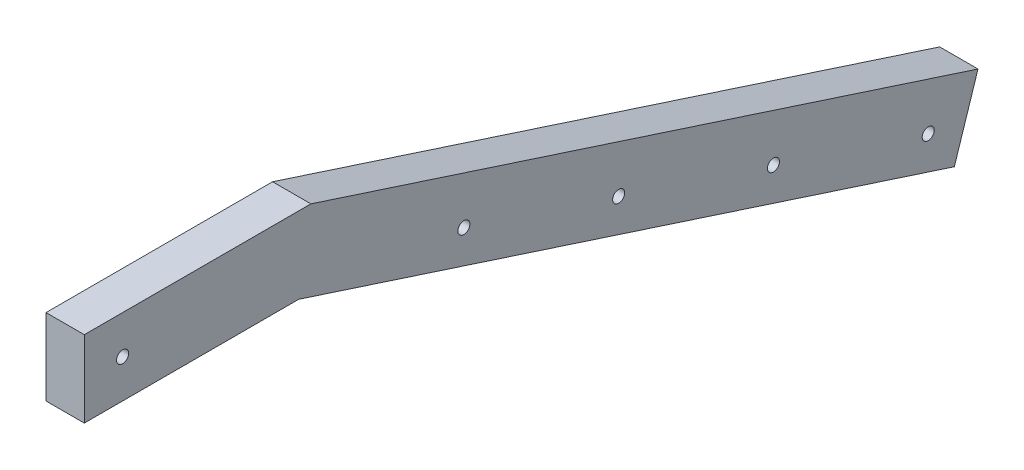
ISO-10303-21;
HEADER;
FILE_DESCRIPTION(('STEP AP214'),'2;1');
FILE_NAME('part.step','',(''),(''),'','','');
FILE_SCHEMA(('AUTOMOTIVE_DESIGN { 1 0 10303 214 1 1 1 1 }'));
ENDSEC;
DATA;
#1=APPLICATION_CONTEXT('core data for automotive mechanical design processes');
#2=APPLICATION_PROTOCOL_DEFINITION('international standard','automotive_design',2000,#1);
#3=PRODUCT_CONTEXT('',#1,'mechanical');
#4=PRODUCT('Part','Part','',(#3));
#5=PRODUCT_RELATED_PRODUCT_CATEGORY('part','',(#4));
#6=PRODUCT_DEFINITION_FORMATION('','',#4);
#7=PRODUCT_DEFINITION_CONTEXT('part definition',#1,'design');
#8=PRODUCT_DEFINITION('design','',#6,#7);
#9=PRODUCT_DEFINITION_SHAPE('','',#8);
#10=(LENGTH_UNIT() NAMED_UNIT(*) SI_UNIT(.MILLI.,.METRE.));
#11=(NAMED_UNIT(*) PLANE_ANGLE_UNIT() SI_UNIT($,.RADIAN.));
#12=(NAMED_UNIT(*) SI_UNIT($,.STERADIAN.) SOLID_ANGLE_UNIT());
#13=UNCERTAINTY_MEASURE_WITH_UNIT(LENGTH_MEASURE(1.E-05),#10,'distance_accuracy_value','');
#14=(GEOMETRIC_REPRESENTATION_CONTEXT(3) GLOBAL_UNCERTAINTY_ASSIGNED_CONTEXT((#13)) GLOBAL_UNIT_ASSIGNED_CONTEXT((#10,
#11,#12)) REPRESENTATION_CONTEXT('',''));
#15=CARTESIAN_POINT('',(0.,0.,0.));
#16=DIRECTION('',(0.,0.,1.));
#17=DIRECTION('',(1.,0.,0.));
#18=AXIS2_PLACEMENT_3D('',#15,#16,#17);
#19=CARTESIAN_POINT('',(25.4,-64.3678934919232,-101.466383411454));
#20=DIRECTION('',(-1.,0.,0.));
#21=DIRECTION('',(0.,0.,1.));
#22=AXIS2_PLACEMENT_3D('',#19,#20,#21);
#23=CYLINDRICAL_SURFACE('',#22,3.99999999999999);
#24=CARTESIAN_POINT('',(25.4,-64.3678934919232,-101.466383411454));
#25=DIRECTION('',(-1.,0.,0.));
#26=DIRECTION('',(0.,0.,1.));
#27=AXIS2_PLACEMENT_3D('',#24,#25,#26);
#28=CIRCLE('',#27,3.99999999999999);
#29=CARTESIAN_POINT('',(25.4,-64.3678934919232,-97.4663834114539));
#30=VERTEX_POINT('',#29);
#31=EDGE_CURVE('E43',#30,#30,#28,.T.);
#32=ORIENTED_EDGE('',*,*,#31,.F.);
#33=EDGE_LOOP('',(#32));
#34=FACE_BOUND('',#33,.T.);
#35=CARTESIAN_POINT('',(0.,-64.3678934919232,-101.466383411454));
#36=DIRECTION('',(-1.,0.,0.));
#37=DIRECTION('',(0.,0.,1.));
#38=AXIS2_PLACEMENT_3D('',#35,#36,#37);
#39=CIRCLE('',#38,3.99999999999999);
#40=CARTESIAN_POINT('',(0.,-64.3678934919232,-97.4663834114539));
#41=VERTEX_POINT('',#40);
#42=EDGE_CURVE('E11',#41,#41,#39,.T.);
#43=ORIENTED_EDGE('',*,*,#42,.T.);
#44=EDGE_LOOP('',(#43));
#45=FACE_BOUND('',#44,.T.);
#46=ADVANCED_FACE('F35',(#34,#45),#23,.F.);
#47=CARTESIAN_POINT('',(25.4,-97.7262780346996,-204.132934345515));
#48=DIRECTION('',(-1.,0.,0.));
#49=DIRECTION('',(0.,0.,1.));
#50=AXIS2_PLACEMENT_3D('',#47,#48,#49);
#51=CYLINDRICAL_SURFACE('',#50,3.99999999999999);
#52=CARTESIAN_POINT('',(25.4,-97.7262780346996,-204.132934345515));
#53=DIRECTION('',(-1.,0.,0.));
#54=DIRECTION('',(0.,0.,1.));
#55=AXIS2_PLACEMENT_3D('',#52,#53,#54);
#56=CIRCLE('',#55,3.99999999999999);
#57=CARTESIAN_POINT('',(25.4,-97.7262780346996,-200.132934345515));
#58=VERTEX_POINT('',#57);
#59=EDGE_CURVE('E150',#58,#58,#56,.T.);
#60=ORIENTED_EDGE('',*,*,#59,.F.);
#61=EDGE_LOOP('',(#60));
#62=FACE_BOUND('',#61,.T.);
#63=CARTESIAN_POINT('',(0.,-97.7262780346996,-204.132934345515));
#64=DIRECTION('',(-1.,0.,0.));
#65=DIRECTION('',(0.,0.,1.));
#66=AXIS2_PLACEMENT_3D('',#63,#64,#65);
#67=CIRCLE('',#66,3.99999999999999);
#68=CARTESIAN_POINT('',(0.,-97.7262780346996,-200.132934345515));
#69=VERTEX_POINT('',#68);
#70=EDGE_CURVE('E153',#69,#69,#67,.T.);
#71=ORIENTED_EDGE('',*,*,#70,.T.);
#72=EDGE_LOOP('',(#71));
#73=FACE_BOUND('',#72,.T.);
#74=ADVANCED_FACE('F162',(#62,#73),#51,.F.);
#75=CARTESIAN_POINT('',(25.4,-131.084662577476,-306.799485279577));
#76=DIRECTION('',(-1.,0.,0.));
#77=DIRECTION('',(0.,0.,1.));
#78=AXIS2_PLACEMENT_3D('',#75,#76,#77);
#79=CYLINDRICAL_SURFACE('',#78,3.99999999999999);
#80=CARTESIAN_POINT('',(25.4,-131.084662577476,-306.799485279577));
#81=DIRECTION('',(-1.,0.,0.));
#82=DIRECTION('',(0.,0.,1.));
#83=AXIS2_PLACEMENT_3D('',#80,#81,#82);
#84=CIRCLE('',#83,3.99999999999999);
#85=CARTESIAN_POINT('',(25.4,-131.084662577476,-302.799485279577));
#86=VERTEX_POINT('',#85);
#87=EDGE_CURVE('E139',#86,#86,#84,.T.);
#88=ORIENTED_EDGE('',*,*,#87,.F.);
#89=EDGE_LOOP('',(#88));
#90=FACE_BOUND('',#89,.T.);
#91=CARTESIAN_POINT('',(0.,-131.084662577476,-306.799485279577));
#92=DIRECTION('',(-1.,0.,0.));
#93=DIRECTION('',(0.,0.,1.));
#94=AXIS2_PLACEMENT_3D('',#91,#92,#93);
#95=CIRCLE('',#94,3.99999999999999);
#96=CARTESIAN_POINT('',(0.,-131.084662577476,-302.799485279577));
#97=VERTEX_POINT('',#96);
#98=EDGE_CURVE('E147',#97,#97,#95,.T.);
#99=ORIENTED_EDGE('',*,*,#98,.T.);
#100=EDGE_LOOP('',(#99));
#101=FACE_BOUND('',#100,.T.);
#102=ADVANCED_FACE('F225',(#90,#101),#79,.F.);
#103=CARTESIAN_POINT('',(25.4,0.,0.));
#104=DIRECTION('',(0.,0.951056516295151,-0.309016994374955));
#105=DIRECTION('',(0.,0.309016994374955,0.951056516295151));
#106=AXIS2_PLACEMENT_3D('',#103,#104,#105);
#107=PLANE('',#106);
#108=DIRECTION('',(0.,-0.309016994374955,-0.951056516295151));
#109=VECTOR('',#108,1.);
#110=CARTESIAN_POINT('',(0.,0.,0.));
#111=LINE('',#110,#109);
#112=CARTESIAN_POINT('',(0.,0.,0.));
#113=VERTEX_POINT('',#112);
#114=CARTESIAN_POINT('',(0.,-143.768898800436,-442.475172995904));
#115=VERTEX_POINT('',#114);
#116=EDGE_CURVE('E123',#113,#115,#111,.T.);
#117=ORIENTED_EDGE('',*,*,#116,.F.);
#118=DIRECTION('',(-1.,0.,0.));
#119=VECTOR('',#118,1.);
#120=CARTESIAN_POINT('',(25.4,0.,0.));
#121=LINE('',#120,#119);
#122=CARTESIAN_POINT('',(25.4,0.,0.));
#123=VERTEX_POINT('',#122);
#124=EDGE_CURVE('E51',#123,#113,#121,.T.);
#125=ORIENTED_EDGE('',*,*,#124,.F.);
#126=DIRECTION('',(0.,-0.309016994374955,-0.951056516295151));
#127=VECTOR('',#126,1.);
#128=CARTESIAN_POINT('',(25.4,0.,0.));
#129=LINE('',#128,#127);
#130=CARTESIAN_POINT('',(25.4,-143.768898800436,-442.475172995904));
#131=VERTEX_POINT('',#130);
#132=EDGE_CURVE('E137',#123,#131,#129,.T.);
#133=ORIENTED_EDGE('',*,*,#132,.T.);
#134=DIRECTION('',(-1.,0.,0.));
#135=VECTOR('',#134,1.);
#136=CARTESIAN_POINT('',(25.4,-143.768898800436,-442.475172995904));
#137=LINE('',#136,#135);
#138=EDGE_CURVE('E83',#131,#115,#137,.T.);
#139=ORIENTED_EDGE('',*,*,#138,.T.);
#140=EDGE_LOOP('',(#117,#125,#133,#139));
#141=FACE_BOUND('',#140,.T.);
#142=ADVANCED_FACE('F183',(#141),#107,.T.);
#143=CARTESIAN_POINT('',(25.4,0.,0.));
#144=DIRECTION('',(0.,-1.,0.));
#145=DIRECTION('',(0.,0.,-1.));
#146=AXIS2_PLACEMENT_3D('',#143,#144,#145);
#147=PLANE('',#146);
#148=DIRECTION('',(0.,0.,1.));
#149=VECTOR('',#148,1.);
#150=CARTESIAN_POINT('',(0.,0.,0.));
#151=LINE('',#150,#149);
#152=CARTESIAN_POINT('',(0.,0.,150.285929568486));
#153=VERTEX_POINT('',#152);
#154=EDGE_CURVE('E74',#113,#153,#151,.T.);
#155=ORIENTED_EDGE('',*,*,#154,.T.);
#156=DIRECTION('',(-1.,0.,0.));
#157=VECTOR('',#156,1.);
#158=CARTESIAN_POINT('',(25.4,0.,150.285929568486));
#159=LINE('',#158,#157);
#160=CARTESIAN_POINT('',(25.4,0.,150.285929568486));
#161=VERTEX_POINT('',#160);
#162=EDGE_CURVE('E110',#161,#153,#159,.T.);
#163=ORIENTED_EDGE('',*,*,#162,.F.);
#164=DIRECTION('',(0.,0.,1.));
#165=VECTOR('',#164,1.);
#166=CARTESIAN_POINT('',(25.4,0.,0.));
#167=LINE('',#166,#165);
#168=EDGE_CURVE('E100',#123,#161,#167,.T.);
#169=ORIENTED_EDGE('',*,*,#168,.F.);
#170=ORIENTED_EDGE('',*,*,#124,.T.);
#171=EDGE_LOOP('',(#155,#163,#169,#170));
#172=FACE_BOUND('',#171,.T.);
#173=ADVANCED_FACE('F212',(#172),#147,.F.);
#174=CARTESIAN_POINT('',(25.4,0.,150.285929568486));
#175=DIRECTION('',(0.,0.,-1.));
#176=DIRECTION('',(-1.,0.,0.));
#177=AXIS2_PLACEMENT_3D('',#174,#175,#176);
#178=PLANE('',#177);
#179=DIRECTION('',(0.,-1.,0.));
#180=VECTOR('',#179,1.);
#181=CARTESIAN_POINT('',(0.,0.,150.285929568486));
#182=LINE('',#181,#180);
#183=CARTESIAN_POINT('',(0.,-50.8,150.285929568486));
#184=VERTEX_POINT('',#183);
#185=EDGE_CURVE('E107',#153,#184,#182,.T.);
#186=ORIENTED_EDGE('',*,*,#185,.T.);
#187=DIRECTION('',(-1.,0.,0.));
#188=VECTOR('',#187,1.);
#189=CARTESIAN_POINT('',(25.4,-50.8,150.285929568486));
#190=LINE('',#189,#188);
#191=CARTESIAN_POINT('',(25.4,-50.8,150.285929568486));
#192=VERTEX_POINT('',#191);
#193=EDGE_CURVE('E104',#192,#184,#190,.T.);
#194=ORIENTED_EDGE('',*,*,#193,.F.);
#195=DIRECTION('',(0.,-1.,0.));
#196=VECTOR('',#195,1.);
#197=CARTESIAN_POINT('',(25.4,0.,150.285929568486));
#198=LINE('',#197,#196);
#199=EDGE_CURVE('E93',#161,#192,#198,.T.);
#200=ORIENTED_EDGE('',*,*,#199,.F.);
#201=ORIENTED_EDGE('',*,*,#162,.T.);
#202=EDGE_LOOP('',(#186,#194,#200,#201));
#203=FACE_BOUND('',#202,.T.);
#204=ADVANCED_FACE('F105',(#203),#178,.F.);
#205=CARTESIAN_POINT('',(25.4,-50.8,150.285929568486));
#206=DIRECTION('',(0.,1.,0.));
#207=DIRECTION('',(0.,0.,1.));
#208=AXIS2_PLACEMENT_3D('',#205,#206,#207);
#209=PLANE('',#208);
#210=DIRECTION('',(0.,0.,-1.));
#211=VECTOR('',#210,1.);
#212=CARTESIAN_POINT('',(0.,-50.8,150.285929568486));
#213=LINE('',#212,#211);
#214=CARTESIAN_POINT('',(0.,-50.8,8.04592956848644));
#215=VERTEX_POINT('',#214);
#216=EDGE_CURVE('E133',#184,#215,#213,.T.);
#217=ORIENTED_EDGE('',*,*,#216,.T.);
#218=DIRECTION('',(-1.,0.,0.));
#219=VECTOR('',#218,1.);
#220=CARTESIAN_POINT('',(25.4,-50.8,8.04592956848644));
#221=LINE('',#220,#219);
#222=CARTESIAN_POINT('',(25.4,-50.8,8.04592956848644));
#223=VERTEX_POINT('',#222);
#224=EDGE_CURVE('E111',#223,#215,#221,.T.);
#225=ORIENTED_EDGE('',*,*,#224,.F.);
#226=DIRECTION('',(0.,0.,-1.));
#227=VECTOR('',#226,1.);
#228=CARTESIAN_POINT('',(25.4,-50.8,150.285929568486));
#229=LINE('',#228,#227);
#230=EDGE_CURVE('E98',#192,#223,#229,.T.);
#231=ORIENTED_EDGE('',*,*,#230,.F.);
#232=ORIENTED_EDGE('',*,*,#193,.T.);
#233=EDGE_LOOP('',(#217,#225,#231,#232));
#234=FACE_BOUND('',#233,.T.);
#235=ADVANCED_FACE('F113',(#234),#209,.F.);
#236=CARTESIAN_POINT('',(25.4,-50.8,8.04592956848644));
#237=DIRECTION('',(0.,0.951056516295151,-0.309016994374955));
#238=DIRECTION('',(0.,0.309016994374955,0.951056516295151));
#239=AXIS2_PLACEMENT_3D('',#236,#237,#238);
#240=PLANE('',#239);
#241=DIRECTION('',(0.,-0.309016994374955,-0.951056516295151));
#242=VECTOR('',#241,1.);
#243=CARTESIAN_POINT('',(0.,-50.8,8.04592956848644));
#244=LINE('',#243,#242);
#245=CARTESIAN_POINT('',(0.,-192.082569828229,-426.777109681657));
#246=VERTEX_POINT('',#245);
#247=EDGE_CURVE('E130',#215,#246,#244,.T.);
#248=ORIENTED_EDGE('',*,*,#247,.T.);
#249=DIRECTION('',(-1.,0.,0.));
#250=VECTOR('',#249,1.);
#251=CARTESIAN_POINT('',(25.4,-192.082569828229,-426.777109681657));
#252=LINE('',#251,#250);
#253=CARTESIAN_POINT('',(25.4,-192.082569828229,-426.777109681657));
#254=VERTEX_POINT('',#253);
#255=EDGE_CURVE('E142',#254,#246,#252,.T.);
#256=ORIENTED_EDGE('',*,*,#255,.F.);
#257=DIRECTION('',(0.,-0.309016994374955,-0.951056516295151));
#258=VECTOR('',#257,1.);
#259=CARTESIAN_POINT('',(25.4,-50.8,8.04592956848644));
#260=LINE('',#259,#258);
#261=EDGE_CURVE('E116',#223,#254,#260,.T.);
#262=ORIENTED_EDGE('',*,*,#261,.F.);
#263=ORIENTED_EDGE('',*,*,#224,.T.);
#264=EDGE_LOOP('',(#248,#256,#262,#263));
#265=FACE_BOUND('',#264,.T.);
#266=ADVANCED_FACE('F187',(#265),#240,.F.);
#267=CARTESIAN_POINT('',(25.4,-143.768898800436,-442.475172995904));
#268=DIRECTION('',(0.,-0.309016994374954,-0.951056516295151));
#269=DIRECTION('',(0.,0.951056516295152,-0.309016994374954));
#270=AXIS2_PLACEMENT_3D('',#267,#268,#269);
#271=PLANE('',#270);
#272=DIRECTION('',(0.,-0.951056516295151,0.309016994374954));
#273=VECTOR('',#272,1.);
#274=CARTESIAN_POINT('',(0.,-143.768898800436,-442.475172995904));
#275=LINE('',#274,#273);
#276=EDGE_CURVE('E126',#115,#246,#275,.T.);
#277=ORIENTED_EDGE('',*,*,#276,.F.);
#278=ORIENTED_EDGE('',*,*,#138,.F.);
#279=DIRECTION('',(0.,-0.951056516295151,0.309016994374954));
#280=VECTOR('',#279,1.);
#281=CARTESIAN_POINT('',(25.4,-143.768898800436,-442.475172995904));
#282=LINE('',#281,#280);
#283=EDGE_CURVE('E118',#131,#254,#282,.T.);
#284=ORIENTED_EDGE('',*,*,#283,.T.);
#285=ORIENTED_EDGE('',*,*,#255,.T.);
#286=EDGE_LOOP('',(#277,#278,#284,#285));
#287=FACE_BOUND('',#286,.T.);
#288=ADVANCED_FACE('F184',(#287),#271,.T.);
#289=CARTESIAN_POINT('',(25.4,0.,0.));
#290=DIRECTION('',(-1.,0.,0.));
#291=DIRECTION('',(0.,0.,1.));
#292=AXIS2_PLACEMENT_3D('',#289,#290,#291);
#293=PLANE('',#292);
#294=ORIENTED_EDGE('',*,*,#31,.T.);
#295=EDGE_LOOP('',(#294));
#296=FACE_BOUND('',#295,.T.);
#297=ORIENTED_EDGE('',*,*,#59,.T.);
#298=EDGE_LOOP('',(#297));
#299=FACE_BOUND('',#298,.T.);
#300=ORIENTED_EDGE('',*,*,#87,.T.);
#301=EDGE_LOOP('',(#300));
#302=FACE_BOUND('',#301,.T.);
#303=CARTESIAN_POINT('',(25.4,-25.4,124.885929568486));
#304=DIRECTION('',(-1.,0.,0.));
#305=DIRECTION('',(0.,0.,1.));
#306=AXIS2_PLACEMENT_3D('',#303,#304,#305);
#307=CIRCLE('',#306,3.99999999999999);
#308=CARTESIAN_POINT('',(25.4,-25.4,128.885929568486));
#309=VERTEX_POINT('',#308);
#310=EDGE_CURVE('E127',#309,#309,#307,.T.);
#311=ORIENTED_EDGE('',*,*,#310,.T.);
#312=EDGE_LOOP('',(#311));
#313=FACE_BOUND('',#312,.T.);
#314=CARTESIAN_POINT('',(25.4,-164.443047120252,-409.466036213639));
#315=DIRECTION('',(-1.,0.,0.));
#316=DIRECTION('',(0.,0.,1.));
#317=AXIS2_PLACEMENT_3D('',#314,#315,#316);
#318=CIRCLE('',#317,3.99999999999999);
#319=CARTESIAN_POINT('',(25.4,-164.443047120252,-405.466036213639));
#320=VERTEX_POINT('',#319);
#321=EDGE_CURVE('E191',#320,#320,#318,.T.);
#322=ORIENTED_EDGE('',*,*,#321,.T.);
#323=EDGE_LOOP('',(#322));
#324=FACE_BOUND('',#323,.T.);
#325=ORIENTED_EDGE('',*,*,#132,.F.);
#326=ORIENTED_EDGE('',*,*,#168,.T.);
#327=ORIENTED_EDGE('',*,*,#199,.T.);
#328=ORIENTED_EDGE('',*,*,#230,.T.);
#329=ORIENTED_EDGE('',*,*,#261,.T.);
#330=ORIENTED_EDGE('',*,*,#283,.F.);
#331=EDGE_LOOP('',(#325,#326,#327,#328,#329,#330));
#332=FACE_BOUND('',#331,.T.);
#333=ADVANCED_FACE('F96',(#296,#299,#302,#313,#324,#332),#293,.F.);
#334=CARTESIAN_POINT('',(0.,0.,0.));
#335=DIRECTION('',(-1.,0.,0.));
#336=DIRECTION('',(0.,0.,1.));
#337=AXIS2_PLACEMENT_3D('',#334,#335,#336);
#338=PLANE('',#337);
#339=ORIENTED_EDGE('',*,*,#42,.F.);
#340=EDGE_LOOP('',(#339));
#341=FACE_BOUND('',#340,.T.);
#342=ORIENTED_EDGE('',*,*,#70,.F.);
#343=EDGE_LOOP('',(#342));
#344=FACE_BOUND('',#343,.T.);
#345=ORIENTED_EDGE('',*,*,#98,.F.);
#346=EDGE_LOOP('',(#345));
#347=FACE_BOUND('',#346,.T.);
#348=CARTESIAN_POINT('',(0.,-25.4,124.885929568486));
#349=DIRECTION('',(-1.,0.,0.));
#350=DIRECTION('',(0.,0.,1.));
#351=AXIS2_PLACEMENT_3D('',#348,#349,#350);
#352=CIRCLE('',#351,3.99999999999999);
#353=CARTESIAN_POINT('',(0.,-25.4,128.885929568486));
#354=VERTEX_POINT('',#353);
#355=EDGE_CURVE('E177',#354,#354,#352,.T.);
#356=ORIENTED_EDGE('',*,*,#355,.F.);
#357=EDGE_LOOP('',(#356));
#358=FACE_BOUND('',#357,.T.);
#359=CARTESIAN_POINT('',(0.,-164.443047120252,-409.466036213639));
#360=DIRECTION('',(-1.,0.,0.));
#361=DIRECTION('',(0.,0.,1.));
#362=AXIS2_PLACEMENT_3D('',#359,#360,#361);
#363=CIRCLE('',#362,3.99999999999999);
#364=CARTESIAN_POINT('',(0.,-164.443047120252,-405.466036213639));
#365=VERTEX_POINT('',#364);
#366=EDGE_CURVE('E181',#365,#365,#363,.T.);
#367=ORIENTED_EDGE('',*,*,#366,.F.);
#368=EDGE_LOOP('',(#367));
#369=FACE_BOUND('',#368,.T.);
#370=ORIENTED_EDGE('',*,*,#116,.T.);
#371=ORIENTED_EDGE('',*,*,#276,.T.);
#372=ORIENTED_EDGE('',*,*,#247,.F.);
#373=ORIENTED_EDGE('',*,*,#216,.F.);
#374=ORIENTED_EDGE('',*,*,#185,.F.);
#375=ORIENTED_EDGE('',*,*,#154,.F.);
#376=EDGE_LOOP('',(#370,#371,#372,#373,#374,#375));
#377=FACE_BOUND('',#376,.T.);
#378=ADVANCED_FACE('F165',(#341,#344,#347,#358,#369,#377),#338,.T.);
#379=CARTESIAN_POINT('',(25.4,-164.443047120252,-409.466036213639));
#380=DIRECTION('',(-1.,0.,0.));
#381=DIRECTION('',(0.,0.,1.));
#382=AXIS2_PLACEMENT_3D('',#379,#380,#381);
#383=CYLINDRICAL_SURFACE('',#382,3.99999999999999);
#384=ORIENTED_EDGE('',*,*,#321,.F.);
#385=EDGE_LOOP('',(#384));
#386=FACE_BOUND('',#385,.T.);
#387=ORIENTED_EDGE('',*,*,#366,.T.);
#388=EDGE_LOOP('',(#387));
#389=FACE_BOUND('',#388,.T.);
#390=ADVANCED_FACE('F168',(#386,#389),#383,.F.);
#391=CARTESIAN_POINT('',(25.4,-25.4,124.885929568486));
#392=DIRECTION('',(-1.,0.,0.));
#393=DIRECTION('',(0.,0.,1.));
#394=AXIS2_PLACEMENT_3D('',#391,#392,#393);
#395=CYLINDRICAL_SURFACE('',#394,3.99999999999999);
#396=ORIENTED_EDGE('',*,*,#310,.F.);
#397=EDGE_LOOP('',(#396));
#398=FACE_BOUND('',#397,.T.);
#399=ORIENTED_EDGE('',*,*,#355,.T.);
#400=EDGE_LOOP('',(#399));
#401=FACE_BOUND('',#400,.T.);
#402=ADVANCED_FACE('F200',(#398,#401),#395,.F.);
#403=CLOSED_SHELL('',(#46,#74,#102,#142,#173,#204,#235,#266,#288,#333,#378,#390,#402));
#404=MANIFOLD_SOLID_BREP('B2',#403);
#405=ADVANCED_BREP_SHAPE_REPRESENTATION('',(#18,#404),#14);
#406=SHAPE_DEFINITION_REPRESENTATION(#9,#405);
ENDSEC;
END-ISO-10303-21;
